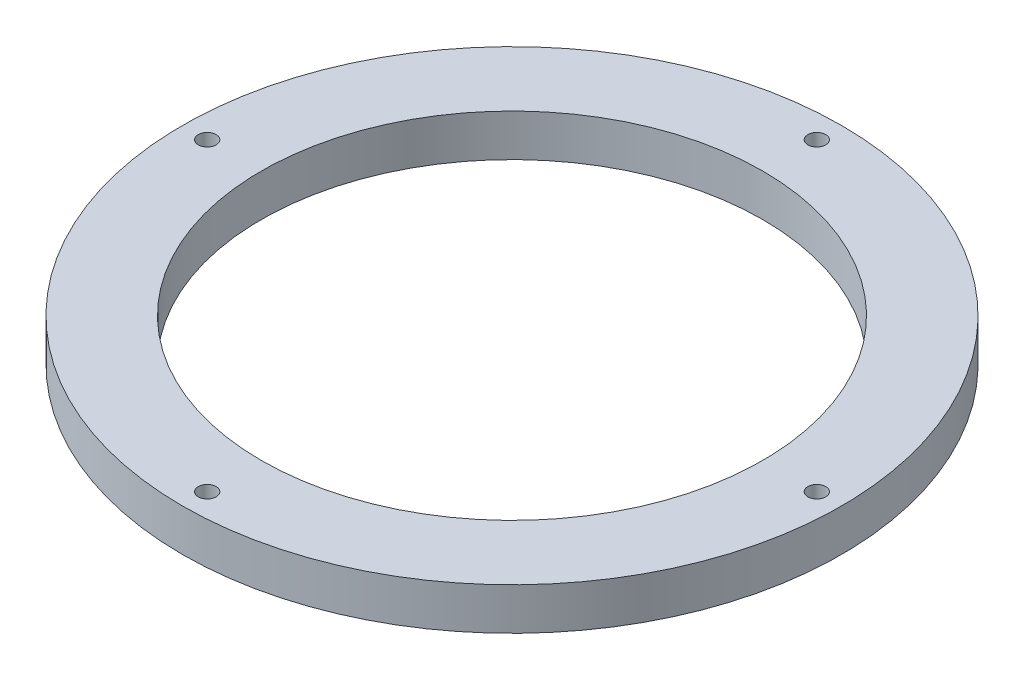
ISO-10303-21;
HEADER;
FILE_DESCRIPTION(('STEP AP214'),'2;1');
FILE_NAME('part.step','',(''),(''),'','','');
FILE_SCHEMA(('AUTOMOTIVE_DESIGN { 1 0 10303 214 1 1 1 1 }'));
ENDSEC;
DATA;
#1=APPLICATION_CONTEXT('core data for automotive mechanical design processes');
#2=APPLICATION_PROTOCOL_DEFINITION('international standard','automotive_design',2000,#1);
#3=PRODUCT_CONTEXT('',#1,'mechanical');
#4=PRODUCT('Part','Part','',(#3));
#5=PRODUCT_RELATED_PRODUCT_CATEGORY('part','',(#4));
#6=PRODUCT_DEFINITION_FORMATION('','',#4);
#7=PRODUCT_DEFINITION_CONTEXT('part definition',#1,'design');
#8=PRODUCT_DEFINITION('design','',#6,#7);
#9=PRODUCT_DEFINITION_SHAPE('','',#8);
#10=(LENGTH_UNIT() NAMED_UNIT(*) SI_UNIT(.MILLI.,.METRE.));
#11=(NAMED_UNIT(*) PLANE_ANGLE_UNIT() SI_UNIT($,.RADIAN.));
#12=(NAMED_UNIT(*) SI_UNIT($,.STERADIAN.) SOLID_ANGLE_UNIT());
#13=UNCERTAINTY_MEASURE_WITH_UNIT(LENGTH_MEASURE(1.E-05),#10,'distance_accuracy_value','');
#14=(GEOMETRIC_REPRESENTATION_CONTEXT(3) GLOBAL_UNCERTAINTY_ASSIGNED_CONTEXT((#13)) GLOBAL_UNIT_ASSIGNED_CONTEXT((#10,
#11,#12)) REPRESENTATION_CONTEXT('',''));
#15=CARTESIAN_POINT('',(0.,0.,0.));
#16=DIRECTION('',(0.,0.,1.));
#17=DIRECTION('',(1.,0.,0.));
#18=AXIS2_PLACEMENT_3D('',#15,#16,#17);
#19=CARTESIAN_POINT('',(62.6885,0.,0.));
#20=DIRECTION('',(0.,-1.,0.));
#21=DIRECTION('',(0.,0.,-1.));
#22=AXIS2_PLACEMENT_3D('',#19,#20,#21);
#23=PLANE('',#22);
#24=CARTESIAN_POINT('',(0.,0.,-57.9825));
#25=DIRECTION('',(0.,-1.,0.));
#26=DIRECTION('',(0.,0.,-1.));
#27=AXIS2_PLACEMENT_3D('',#24,#25,#26);
#28=CIRCLE('',#27,4.225);
#29=CARTESIAN_POINT('',(0.,0.,-62.2075));
#30=VERTEX_POINT('',#29);
#31=EDGE_CURVE('E114',#30,#30,#28,.T.);
#32=ORIENTED_EDGE('',*,*,#31,.F.);
#33=EDGE_LOOP('',(#32));
#34=FACE_BOUND('',#33,.T.);
#35=CARTESIAN_POINT('',(57.9825,0.,0.));
#36=DIRECTION('',(0.,-1.,0.));
#37=DIRECTION('',(0.,0.,-1.));
#38=AXIS2_PLACEMENT_3D('',#35,#36,#37);
#39=CIRCLE('',#38,4.225);
#40=CARTESIAN_POINT('',(57.9825,0.,-4.225));
#41=VERTEX_POINT('',#40);
#42=EDGE_CURVE('E98',#41,#41,#39,.T.);
#43=ORIENTED_EDGE('',*,*,#42,.F.);
#44=EDGE_LOOP('',(#43));
#45=FACE_BOUND('',#44,.T.);
#46=CARTESIAN_POINT('',(-57.9825,0.,0.));
#47=DIRECTION('',(0.,-1.,0.));
#48=DIRECTION('',(0.,0.,-1.));
#49=AXIS2_PLACEMENT_3D('',#46,#47,#48);
#50=CIRCLE('',#49,4.225);
#51=CARTESIAN_POINT('',(-57.9825,0.,-4.225));
#52=VERTEX_POINT('',#51);
#53=EDGE_CURVE('E82',#52,#52,#50,.T.);
#54=ORIENTED_EDGE('',*,*,#53,.F.);
#55=EDGE_LOOP('',(#54));
#56=FACE_BOUND('',#55,.T.);
#57=CARTESIAN_POINT('',(0.,0.,57.9825));
#58=DIRECTION('',(0.,-1.,0.));
#59=DIRECTION('',(0.,0.,-1.));
#60=AXIS2_PLACEMENT_3D('',#57,#58,#59);
#61=CIRCLE('',#60,4.225);
#62=CARTESIAN_POINT('',(0.,0.,53.7575));
#63=VERTEX_POINT('',#62);
#64=EDGE_CURVE('E67',#63,#63,#61,.T.);
#65=ORIENTED_EDGE('',*,*,#64,.F.);
#66=EDGE_LOOP('',(#65));
#67=FACE_BOUND('',#66,.T.);
#68=CARTESIAN_POINT('',(0.,0.,0.));
#69=DIRECTION('',(0.,-1.,0.));
#70=DIRECTION('',(0.,0.,-1.));
#71=AXIS2_PLACEMENT_3D('',#68,#69,#70);
#72=CIRCLE('',#71,62.6885);
#73=CARTESIAN_POINT('',(0.,0.,-62.6885));
#74=VERTEX_POINT('',#73);
#75=EDGE_CURVE('E51',#74,#74,#72,.T.);
#76=ORIENTED_EDGE('',*,*,#75,.T.);
#77=EDGE_LOOP('',(#76));
#78=FACE_BOUND('',#77,.T.);
#79=CARTESIAN_POINT('',(0.,0.,0.));
#80=DIRECTION('',(0.,-1.,0.));
#81=DIRECTION('',(0.,0.,-1.));
#82=AXIS2_PLACEMENT_3D('',#79,#80,#81);
#83=CIRCLE('',#82,47.6885);
#84=CARTESIAN_POINT('',(0.,0.,-47.6885));
#85=VERTEX_POINT('',#84);
#86=EDGE_CURVE('E10',#85,#85,#83,.T.);
#87=ORIENTED_EDGE('',*,*,#86,.F.);
#88=EDGE_LOOP('',(#87));
#89=FACE_BOUND('',#88,.T.);
#90=ADVANCED_FACE('F40',(#34,#45,#56,#67,#78,#89),#23,.T.);
#91=CARTESIAN_POINT('',(0.,0.,0.));
#92=DIRECTION('',(0.,-1.,0.));
#93=DIRECTION('',(0.,0.,-1.));
#94=AXIS2_PLACEMENT_3D('',#91,#92,#93);
#95=CYLINDRICAL_SURFACE('',#94,47.6885);
#96=ORIENTED_EDGE('',*,*,#86,.T.);
#97=EDGE_LOOP('',(#96));
#98=FACE_BOUND('',#97,.T.);
#99=CARTESIAN_POINT('',(0.,8.,0.));
#100=DIRECTION('',(0.,-1.,0.));
#101=DIRECTION('',(0.,0.,-1.));
#102=AXIS2_PLACEMENT_3D('',#99,#100,#101);
#103=CIRCLE('',#102,47.6885);
#104=CARTESIAN_POINT('',(0.,8.,-47.6885));
#105=VERTEX_POINT('',#104);
#106=EDGE_CURVE('E43',#105,#105,#103,.T.);
#107=ORIENTED_EDGE('',*,*,#106,.F.);
#108=EDGE_LOOP('',(#107));
#109=FACE_BOUND('',#108,.T.);
#110=ADVANCED_FACE('F123',(#98,#109),#95,.F.);
#111=CARTESIAN_POINT('',(47.6885,8.,0.));
#112=DIRECTION('',(0.,1.,0.));
#113=DIRECTION('',(0.,0.,1.));
#114=AXIS2_PLACEMENT_3D('',#111,#112,#113);
#115=PLANE('',#114);
#116=CARTESIAN_POINT('',(0.,8.,-57.9825));
#117=DIRECTION('',(0.,-1.,0.));
#118=DIRECTION('',(0.,0.,-1.));
#119=AXIS2_PLACEMENT_3D('',#116,#117,#118);
#120=CIRCLE('',#119,1.7);
#121=CARTESIAN_POINT('',(0.,8.,-59.6825));
#122=VERTEX_POINT('',#121);
#123=EDGE_CURVE('E101',#122,#122,#120,.T.);
#124=ORIENTED_EDGE('',*,*,#123,.T.);
#125=EDGE_LOOP('',(#124));
#126=FACE_BOUND('',#125,.T.);
#127=CARTESIAN_POINT('',(57.9825,8.,0.));
#128=DIRECTION('',(0.,-1.,0.));
#129=DIRECTION('',(0.,0.,-1.));
#130=AXIS2_PLACEMENT_3D('',#127,#128,#129);
#131=CIRCLE('',#130,1.7);
#132=CARTESIAN_POINT('',(57.9825,8.,-1.7));
#133=VERTEX_POINT('',#132);
#134=EDGE_CURVE('E88',#133,#133,#131,.T.);
#135=ORIENTED_EDGE('',*,*,#134,.T.);
#136=EDGE_LOOP('',(#135));
#137=FACE_BOUND('',#136,.T.);
#138=CARTESIAN_POINT('',(-57.9825,8.,0.));
#139=DIRECTION('',(0.,-1.,0.));
#140=DIRECTION('',(0.,0.,-1.));
#141=AXIS2_PLACEMENT_3D('',#138,#139,#140);
#142=CIRCLE('',#141,1.7);
#143=CARTESIAN_POINT('',(-57.9825,8.,-1.7));
#144=VERTEX_POINT('',#143);
#145=EDGE_CURVE('E72',#144,#144,#142,.T.);
#146=ORIENTED_EDGE('',*,*,#145,.T.);
#147=EDGE_LOOP('',(#146));
#148=FACE_BOUND('',#147,.T.);
#149=CARTESIAN_POINT('',(0.,8.,57.9825));
#150=DIRECTION('',(0.,-1.,0.));
#151=DIRECTION('',(0.,0.,-1.));
#152=AXIS2_PLACEMENT_3D('',#149,#150,#151);
#153=CIRCLE('',#152,1.7);
#154=CARTESIAN_POINT('',(0.,8.,56.2825));
#155=VERTEX_POINT('',#154);
#156=EDGE_CURVE('E57',#155,#155,#153,.T.);
#157=ORIENTED_EDGE('',*,*,#156,.T.);
#158=EDGE_LOOP('',(#157));
#159=FACE_BOUND('',#158,.T.);
#160=ORIENTED_EDGE('',*,*,#106,.T.);
#161=EDGE_LOOP('',(#160));
#162=FACE_BOUND('',#161,.T.);
#163=CARTESIAN_POINT('',(0.,8.,0.));
#164=DIRECTION('',(0.,-1.,0.));
#165=DIRECTION('',(0.,0.,-1.));
#166=AXIS2_PLACEMENT_3D('',#163,#164,#165);
#167=CIRCLE('',#166,62.6885);
#168=CARTESIAN_POINT('',(0.,8.,-62.6885));
#169=VERTEX_POINT('',#168);
#170=EDGE_CURVE('E50',#169,#169,#167,.T.);
#171=ORIENTED_EDGE('',*,*,#170,.F.);
#172=EDGE_LOOP('',(#171));
#173=FACE_BOUND('',#172,.T.);
#174=ADVANCED_FACE('F131',(#126,#137,#148,#159,#162,#173),#115,.T.);
#175=CARTESIAN_POINT('',(0.,0.,0.));
#176=DIRECTION('',(0.,-1.,0.));
#177=DIRECTION('',(0.,0.,-1.));
#178=AXIS2_PLACEMENT_3D('',#175,#176,#177);
#179=CYLINDRICAL_SURFACE('',#178,62.6885);
#180=ORIENTED_EDGE('',*,*,#170,.T.);
#181=EDGE_LOOP('',(#180));
#182=FACE_BOUND('',#181,.T.);
#183=ORIENTED_EDGE('',*,*,#75,.F.);
#184=EDGE_LOOP('',(#183));
#185=FACE_BOUND('',#184,.T.);
#186=ADVANCED_FACE('F132',(#182,#185),#179,.T.);
#187=CARTESIAN_POINT('',(0.,0.,57.9825));
#188=DIRECTION('',(0.,-1.,0.));
#189=DIRECTION('',(0.,0.,-1.));
#190=AXIS2_PLACEMENT_3D('',#187,#188,#189);
#191=CYLINDRICAL_SURFACE('',#190,1.7);
#192=ORIENTED_EDGE('',*,*,#156,.F.);
#193=EDGE_LOOP('',(#192));
#194=FACE_BOUND('',#193,.T.);
#195=CARTESIAN_POINT('',(0.,2.3,57.9825));
#196=DIRECTION('',(0.,-1.,0.));
#197=DIRECTION('',(0.,0.,-1.));
#198=AXIS2_PLACEMENT_3D('',#195,#196,#197);
#199=CIRCLE('',#198,1.7);
#200=CARTESIAN_POINT('',(0.,2.3,56.2825));
#201=VERTEX_POINT('',#200);
#202=EDGE_CURVE('E56',#201,#201,#199,.T.);
#203=ORIENTED_EDGE('',*,*,#202,.T.);
#204=EDGE_LOOP('',(#203));
#205=FACE_BOUND('',#204,.T.);
#206=ADVANCED_FACE('F134',(#194,#205),#191,.F.);
#207=CARTESIAN_POINT('',(4.2,2.3,57.9825));
#208=DIRECTION('',(0.,1.,0.));
#209=DIRECTION('',(0.,0.,1.));
#210=AXIS2_PLACEMENT_3D('',#207,#208,#209);
#211=PLANE('',#210);
#212=ORIENTED_EDGE('',*,*,#202,.F.);
#213=EDGE_LOOP('',(#212));
#214=FACE_BOUND('',#213,.T.);
#215=CARTESIAN_POINT('',(0.,2.3,57.9825));
#216=DIRECTION('',(0.,-1.,0.));
#217=DIRECTION('',(0.,0.,-1.));
#218=AXIS2_PLACEMENT_3D('',#215,#216,#217);
#219=CIRCLE('',#218,4.2);
#220=CARTESIAN_POINT('',(0.,2.3,53.7825));
#221=VERTEX_POINT('',#220);
#222=EDGE_CURVE('E65',#221,#221,#219,.T.);
#223=ORIENTED_EDGE('',*,*,#222,.T.);
#224=EDGE_LOOP('',(#223));
#225=FACE_BOUND('',#224,.T.);
#226=ADVANCED_FACE('F143',(#214,#225),#211,.F.);
#227=CARTESIAN_POINT('',(0.,0.,57.9825));
#228=DIRECTION('',(0.,-1.,0.));
#229=DIRECTION('',(0.,0.,-1.));
#230=AXIS2_PLACEMENT_3D('',#227,#228,#229);
#231=CYLINDRICAL_SURFACE('',#230,4.2);
#232=ORIENTED_EDGE('',*,*,#222,.F.);
#233=EDGE_LOOP('',(#232));
#234=FACE_BOUND('',#233,.T.);
#235=CARTESIAN_POINT('',(0.,0.0249999999999975,57.9825));
#236=DIRECTION('',(0.,-1.,0.));
#237=DIRECTION('',(0.,0.,-1.));
#238=AXIS2_PLACEMENT_3D('',#235,#236,#237);
#239=CIRCLE('',#238,4.2);
#240=CARTESIAN_POINT('',(0.,0.0249999999999975,53.7825));
#241=VERTEX_POINT('',#240);
#242=EDGE_CURVE('E63',#241,#241,#239,.T.);
#243=ORIENTED_EDGE('',*,*,#242,.T.);
#244=EDGE_LOOP('',(#243));
#245=FACE_BOUND('',#244,.T.);
#246=ADVANCED_FACE('F182',(#234,#245),#231,.F.);
#247=CARTESIAN_POINT('',(0.,0.,57.9825));
#248=DIRECTION('',(0.,-1.,0.));
#249=DIRECTION('',(0.,0.,-1.));
#250=AXIS2_PLACEMENT_3D('',#247,#248,#249);
#251=CONICAL_SURFACE('',#250,4.225,0.785398163397461);
#252=ORIENTED_EDGE('',*,*,#242,.F.);
#253=EDGE_LOOP('',(#252));
#254=FACE_BOUND('',#253,.T.);
#255=ORIENTED_EDGE('',*,*,#64,.T.);
#256=EDGE_LOOP('',(#255));
#257=FACE_BOUND('',#256,.T.);
#258=ADVANCED_FACE('F188',(#254,#257),#251,.F.);
#259=CARTESIAN_POINT('',(-57.9825,0.,0.));
#260=DIRECTION('',(0.,-1.,0.));
#261=DIRECTION('',(0.,0.,-1.));
#262=AXIS2_PLACEMENT_3D('',#259,#260,#261);
#263=CYLINDRICAL_SURFACE('',#262,1.7);
#264=ORIENTED_EDGE('',*,*,#145,.F.);
#265=EDGE_LOOP('',(#264));
#266=FACE_BOUND('',#265,.T.);
#267=CARTESIAN_POINT('',(-57.9825,2.3,0.));
#268=DIRECTION('',(0.,-1.,0.));
#269=DIRECTION('',(0.,0.,-1.));
#270=AXIS2_PLACEMENT_3D('',#267,#268,#269);
#271=CIRCLE('',#270,1.7);
#272=CARTESIAN_POINT('',(-57.9825,2.3,-1.7));
#273=VERTEX_POINT('',#272);
#274=EDGE_CURVE('E74',#273,#273,#271,.T.);
#275=ORIENTED_EDGE('',*,*,#274,.T.);
#276=EDGE_LOOP('',(#275));
#277=FACE_BOUND('',#276,.T.);
#278=ADVANCED_FACE('F199',(#266,#277),#263,.F.);
#279=CARTESIAN_POINT('',(-53.7825,2.3,0.));
#280=DIRECTION('',(0.,1.,0.));
#281=DIRECTION('',(0.,0.,1.));
#282=AXIS2_PLACEMENT_3D('',#279,#280,#281);
#283=PLANE('',#282);
#284=ORIENTED_EDGE('',*,*,#274,.F.);
#285=EDGE_LOOP('',(#284));
#286=FACE_BOUND('',#285,.T.);
#287=CARTESIAN_POINT('',(-57.9825,2.3,0.));
#288=DIRECTION('',(0.,-1.,0.));
#289=DIRECTION('',(0.,0.,-1.));
#290=AXIS2_PLACEMENT_3D('',#287,#288,#289);
#291=CIRCLE('',#290,4.2);
#292=CARTESIAN_POINT('',(-57.9825,2.3,-4.2));
#293=VERTEX_POINT('',#292);
#294=EDGE_CURVE('E80',#293,#293,#291,.T.);
#295=ORIENTED_EDGE('',*,*,#294,.T.);
#296=EDGE_LOOP('',(#295));
#297=FACE_BOUND('',#296,.T.);
#298=ADVANCED_FACE('F209',(#286,#297),#283,.F.);
#299=CARTESIAN_POINT('',(-57.9825,0.,0.));
#300=DIRECTION('',(0.,-1.,0.));
#301=DIRECTION('',(0.,0.,-1.));
#302=AXIS2_PLACEMENT_3D('',#299,#300,#301);
#303=CYLINDRICAL_SURFACE('',#302,4.2);
#304=ORIENTED_EDGE('',*,*,#294,.F.);
#305=EDGE_LOOP('',(#304));
#306=FACE_BOUND('',#305,.T.);
#307=CARTESIAN_POINT('',(-57.9825,0.0249999999999975,0.));
#308=DIRECTION('',(0.,-1.,0.));
#309=DIRECTION('',(0.,0.,-1.));
#310=AXIS2_PLACEMENT_3D('',#307,#308,#309);
#311=CIRCLE('',#310,4.2);
#312=CARTESIAN_POINT('',(-57.9825,0.0249999999999975,-4.2));
#313=VERTEX_POINT('',#312);
#314=EDGE_CURVE('E78',#313,#313,#311,.T.);
#315=ORIENTED_EDGE('',*,*,#314,.T.);
#316=EDGE_LOOP('',(#315));
#317=FACE_BOUND('',#316,.T.);
#318=ADVANCED_FACE('F219',(#306,#317),#303,.F.);
#319=CARTESIAN_POINT('',(-57.9825,0.,0.));
#320=DIRECTION('',(0.,-1.,0.));
#321=DIRECTION('',(0.,0.,-1.));
#322=AXIS2_PLACEMENT_3D('',#319,#320,#321);
#323=CONICAL_SURFACE('',#322,4.225,0.785398163397444);
#324=ORIENTED_EDGE('',*,*,#314,.F.);
#325=EDGE_LOOP('',(#324));
#326=FACE_BOUND('',#325,.T.);
#327=ORIENTED_EDGE('',*,*,#53,.T.);
#328=EDGE_LOOP('',(#327));
#329=FACE_BOUND('',#328,.T.);
#330=ADVANCED_FACE('F228',(#326,#329),#323,.F.);
#331=CARTESIAN_POINT('',(57.9825,0.,0.));
#332=DIRECTION('',(0.,-1.,0.));
#333=DIRECTION('',(0.,0.,-1.));
#334=AXIS2_PLACEMENT_3D('',#331,#332,#333);
#335=CYLINDRICAL_SURFACE('',#334,1.7);
#336=ORIENTED_EDGE('',*,*,#134,.F.);
#337=EDGE_LOOP('',(#336));
#338=FACE_BOUND('',#337,.T.);
#339=CARTESIAN_POINT('',(57.9825,2.3,0.));
#340=DIRECTION('',(0.,-1.,0.));
#341=DIRECTION('',(0.,0.,-1.));
#342=AXIS2_PLACEMENT_3D('',#339,#340,#341);
#343=CIRCLE('',#342,1.7);
#344=CARTESIAN_POINT('',(57.9825,2.3,-1.7));
#345=VERTEX_POINT('',#344);
#346=EDGE_CURVE('E90',#345,#345,#343,.T.);
#347=ORIENTED_EDGE('',*,*,#346,.T.);
#348=EDGE_LOOP('',(#347));
#349=FACE_BOUND('',#348,.T.);
#350=ADVANCED_FACE('F238',(#338,#349),#335,.F.);
#351=CARTESIAN_POINT('',(62.1825,2.3,0.));
#352=DIRECTION('',(0.,1.,0.));
#353=DIRECTION('',(0.,0.,1.));
#354=AXIS2_PLACEMENT_3D('',#351,#352,#353);
#355=PLANE('',#354);
#356=ORIENTED_EDGE('',*,*,#346,.F.);
#357=EDGE_LOOP('',(#356));
#358=FACE_BOUND('',#357,.T.);
#359=CARTESIAN_POINT('',(57.9825,2.3,0.));
#360=DIRECTION('',(0.,-1.,0.));
#361=DIRECTION('',(0.,0.,-1.));
#362=AXIS2_PLACEMENT_3D('',#359,#360,#361);
#363=CIRCLE('',#362,4.2);
#364=CARTESIAN_POINT('',(57.9825,2.3,-4.2));
#365=VERTEX_POINT('',#364);
#366=EDGE_CURVE('E95',#365,#365,#363,.T.);
#367=ORIENTED_EDGE('',*,*,#366,.T.);
#368=EDGE_LOOP('',(#367));
#369=FACE_BOUND('',#368,.T.);
#370=ADVANCED_FACE('F246',(#358,#369),#355,.F.);
#371=CARTESIAN_POINT('',(57.9825,0.,0.));
#372=DIRECTION('',(0.,-1.,0.));
#373=DIRECTION('',(0.,0.,-1.));
#374=AXIS2_PLACEMENT_3D('',#371,#372,#373);
#375=CYLINDRICAL_SURFACE('',#374,4.2);
#376=ORIENTED_EDGE('',*,*,#366,.F.);
#377=EDGE_LOOP('',(#376));
#378=FACE_BOUND('',#377,.T.);
#379=CARTESIAN_POINT('',(57.9825,0.0249999999999975,0.));
#380=DIRECTION('',(0.,-1.,0.));
#381=DIRECTION('',(0.,0.,-1.));
#382=AXIS2_PLACEMENT_3D('',#379,#380,#381);
#383=CIRCLE('',#382,4.2);
#384=CARTESIAN_POINT('',(57.9825,0.0249999999999975,-4.2));
#385=VERTEX_POINT('',#384);
#386=EDGE_CURVE('E92',#385,#385,#383,.T.);
#387=ORIENTED_EDGE('',*,*,#386,.T.);
#388=EDGE_LOOP('',(#387));
#389=FACE_BOUND('',#388,.T.);
#390=ADVANCED_FACE('F257',(#378,#389),#375,.F.);
#391=CARTESIAN_POINT('',(57.9825,0.,0.));
#392=DIRECTION('',(0.,-1.,0.));
#393=DIRECTION('',(0.,0.,-1.));
#394=AXIS2_PLACEMENT_3D('',#391,#392,#393);
#395=CONICAL_SURFACE('',#394,4.225,0.785398163397444);
#396=ORIENTED_EDGE('',*,*,#386,.F.);
#397=EDGE_LOOP('',(#396));
#398=FACE_BOUND('',#397,.T.);
#399=ORIENTED_EDGE('',*,*,#42,.T.);
#400=EDGE_LOOP('',(#399));
#401=FACE_BOUND('',#400,.T.);
#402=ADVANCED_FACE('F269',(#398,#401),#395,.F.);
#403=CARTESIAN_POINT('',(0.,0.,-57.9825));
#404=DIRECTION('',(0.,-1.,0.));
#405=DIRECTION('',(0.,0.,-1.));
#406=AXIS2_PLACEMENT_3D('',#403,#404,#405);
#407=CYLINDRICAL_SURFACE('',#406,1.7);
#408=ORIENTED_EDGE('',*,*,#123,.F.);
#409=EDGE_LOOP('',(#408));
#410=FACE_BOUND('',#409,.T.);
#411=CARTESIAN_POINT('',(0.,2.3,-57.9825));
#412=DIRECTION('',(0.,-1.,0.));
#413=DIRECTION('',(0.,0.,-1.));
#414=AXIS2_PLACEMENT_3D('',#411,#412,#413);
#415=CIRCLE('',#414,1.7);
#416=CARTESIAN_POINT('',(0.,2.3,-59.6825));
#417=VERTEX_POINT('',#416);
#418=EDGE_CURVE('E102',#417,#417,#415,.T.);
#419=ORIENTED_EDGE('',*,*,#418,.T.);
#420=EDGE_LOOP('',(#419));
#421=FACE_BOUND('',#420,.T.);
#422=ADVANCED_FACE('F278',(#410,#421),#407,.F.);
#423=CARTESIAN_POINT('',(4.2,2.3,-57.9825));
#424=DIRECTION('',(0.,1.,0.));
#425=DIRECTION('',(0.,0.,1.));
#426=AXIS2_PLACEMENT_3D('',#423,#424,#425);
#427=PLANE('',#426);
#428=ORIENTED_EDGE('',*,*,#418,.F.);
#429=EDGE_LOOP('',(#428));
#430=FACE_BOUND('',#429,.T.);
#431=CARTESIAN_POINT('',(0.,2.3,-57.9825));
#432=DIRECTION('',(0.,-1.,0.));
#433=DIRECTION('',(0.,0.,-1.));
#434=AXIS2_PLACEMENT_3D('',#431,#432,#433);
#435=CIRCLE('',#434,4.2);
#436=CARTESIAN_POINT('',(0.,2.3,-62.1825));
#437=VERTEX_POINT('',#436);
#438=EDGE_CURVE('E110',#437,#437,#435,.T.);
#439=ORIENTED_EDGE('',*,*,#438,.T.);
#440=EDGE_LOOP('',(#439));
#441=FACE_BOUND('',#440,.T.);
#442=ADVANCED_FACE('F286',(#430,#441),#427,.F.);
#443=CARTESIAN_POINT('',(0.,0.,-57.9825));
#444=DIRECTION('',(0.,-1.,0.));
#445=DIRECTION('',(0.,0.,-1.));
#446=AXIS2_PLACEMENT_3D('',#443,#444,#445);
#447=CYLINDRICAL_SURFACE('',#446,4.2);
#448=ORIENTED_EDGE('',*,*,#438,.F.);
#449=EDGE_LOOP('',(#448));
#450=FACE_BOUND('',#449,.T.);
#451=CARTESIAN_POINT('',(0.,0.0249999999999975,-57.9825));
#452=DIRECTION('',(0.,-1.,0.));
#453=DIRECTION('',(0.,0.,-1.));
#454=AXIS2_PLACEMENT_3D('',#451,#452,#453);
#455=CIRCLE('',#454,4.2);
#456=CARTESIAN_POINT('',(0.,0.0249999999999975,-62.1825));
#457=VERTEX_POINT('',#456);
#458=EDGE_CURVE('E109',#457,#457,#455,.T.);
#459=ORIENTED_EDGE('',*,*,#458,.T.);
#460=EDGE_LOOP('',(#459));
#461=FACE_BOUND('',#460,.T.);
#462=ADVANCED_FACE('F298',(#450,#461),#447,.F.);
#463=CARTESIAN_POINT('',(0.,0.,-57.9825));
#464=DIRECTION('',(0.,-1.,0.));
#465=DIRECTION('',(0.,0.,-1.));
#466=AXIS2_PLACEMENT_3D('',#463,#464,#465);
#467=CONICAL_SURFACE('',#466,4.225,0.785398163397461);
#468=ORIENTED_EDGE('',*,*,#458,.F.);
#469=EDGE_LOOP('',(#468));
#470=FACE_BOUND('',#469,.T.);
#471=ORIENTED_EDGE('',*,*,#31,.T.);
#472=EDGE_LOOP('',(#471));
#473=FACE_BOUND('',#472,.T.);
#474=ADVANCED_FACE('F120',(#470,#473),#467,.F.);
#475=CLOSED_SHELL('',(#90,#110,#174,#186,#206,#226,#246,#258,#278,#298,#318,#330,#350,#370,#390,
#402,#422,#442,#462,#474));
#476=MANIFOLD_SOLID_BREP('B2',#475);
#477=ADVANCED_BREP_SHAPE_REPRESENTATION('',(#18,#476),#14);
#478=SHAPE_DEFINITION_REPRESENTATION(#9,#477);
ENDSEC;
END-ISO-10303-21;
